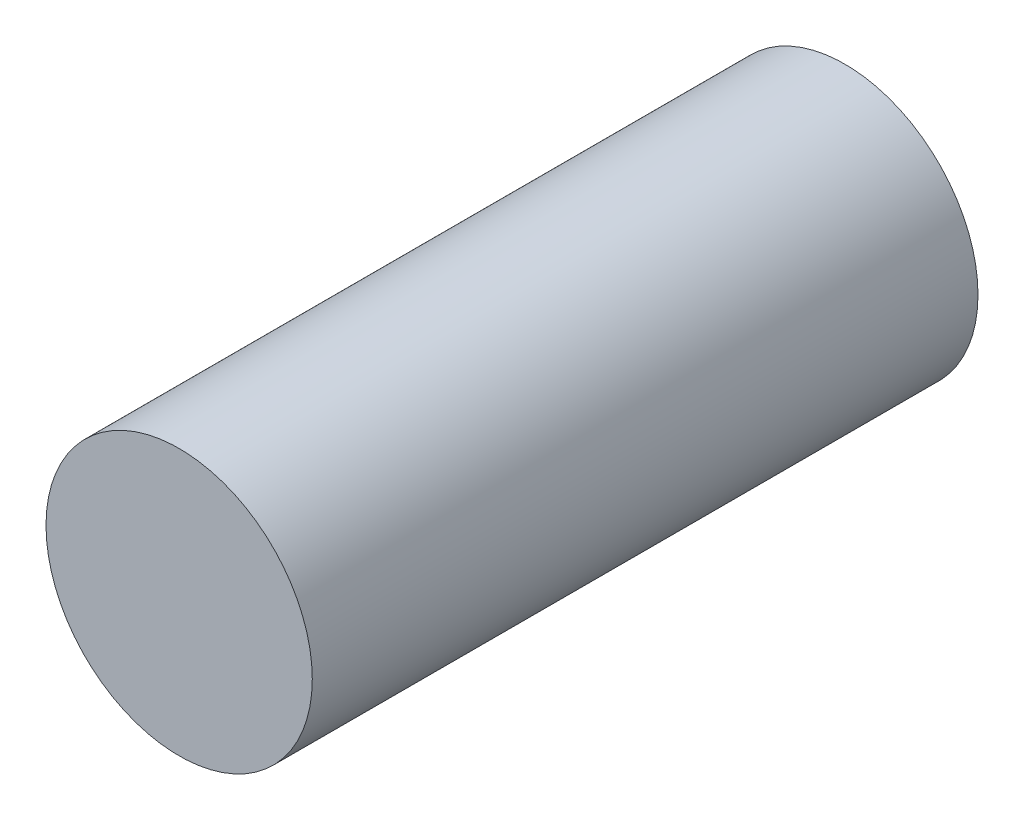
ISO-10303-21;
HEADER;
FILE_DESCRIPTION(('STEP AP214'),'2;1');
FILE_NAME('part.step','',(''),(''),'','','');
FILE_SCHEMA(('AUTOMOTIVE_DESIGN { 1 0 10303 214 1 1 1 1 }'));
ENDSEC;
DATA;
#1=APPLICATION_CONTEXT('core data for automotive mechanical design processes');
#2=APPLICATION_PROTOCOL_DEFINITION('international standard','automotive_design',2000,#1);
#3=PRODUCT_CONTEXT('',#1,'mechanical');
#4=PRODUCT('Part','Part','',(#3));
#5=PRODUCT_RELATED_PRODUCT_CATEGORY('part','',(#4));
#6=PRODUCT_DEFINITION_FORMATION('','',#4);
#7=PRODUCT_DEFINITION_CONTEXT('part definition',#1,'design');
#8=PRODUCT_DEFINITION('design','',#6,#7);
#9=PRODUCT_DEFINITION_SHAPE('','',#8);
#10=(LENGTH_UNIT() NAMED_UNIT(*) SI_UNIT(.MILLI.,.METRE.));
#11=(NAMED_UNIT(*) PLANE_ANGLE_UNIT() SI_UNIT($,.RADIAN.));
#12=(NAMED_UNIT(*) SI_UNIT($,.STERADIAN.) SOLID_ANGLE_UNIT());
#13=UNCERTAINTY_MEASURE_WITH_UNIT(LENGTH_MEASURE(1.E-05),#10,'distance_accuracy_value','');
#14=(GEOMETRIC_REPRESENTATION_CONTEXT(3) GLOBAL_UNCERTAINTY_ASSIGNED_CONTEXT((#13)) GLOBAL_UNIT_ASSIGNED_CONTEXT((#10,
#11,#12)) REPRESENTATION_CONTEXT('',''));
#15=CARTESIAN_POINT('',(0.,0.,0.));
#16=DIRECTION('',(0.,0.,1.));
#17=DIRECTION('',(1.,0.,0.));
#18=AXIS2_PLACEMENT_3D('',#15,#16,#17);
#19=CARTESIAN_POINT('',(0.,0.,15.875));
#20=DIRECTION('',(0.,0.,-1.));
#21=DIRECTION('',(-1.,0.,0.));
#22=AXIS2_PLACEMENT_3D('',#19,#20,#21);
#23=CYLINDRICAL_SURFACE('',#22,3.175);
#24=CARTESIAN_POINT('',(0.,0.,15.875));
#25=DIRECTION('',(0.,0.,1.));
#26=DIRECTION('',(1.,0.,0.));
#27=AXIS2_PLACEMENT_3D('',#24,#25,#26);
#28=CIRCLE('',#27,3.175);
#29=CARTESIAN_POINT('',(3.175,0.,15.875));
#30=VERTEX_POINT('',#29);
#31=EDGE_CURVE('E10',#30,#30,#28,.T.);
#32=ORIENTED_EDGE('',*,*,#31,.F.);
#33=EDGE_LOOP('',(#32));
#34=FACE_BOUND('',#33,.T.);
#35=CARTESIAN_POINT('',(0.,0.,0.));
#36=DIRECTION('',(0.,0.,1.));
#37=DIRECTION('',(1.,0.,0.));
#38=AXIS2_PLACEMENT_3D('',#35,#36,#37);
#39=CIRCLE('',#38,3.175);
#40=CARTESIAN_POINT('',(3.175,0.,0.));
#41=VERTEX_POINT('',#40);
#42=EDGE_CURVE('E34',#41,#41,#39,.T.);
#43=ORIENTED_EDGE('',*,*,#42,.T.);
#44=EDGE_LOOP('',(#43));
#45=FACE_BOUND('',#44,.T.);
#46=ADVANCED_FACE('F31',(#34,#45),#23,.T.);
#47=CARTESIAN_POINT('',(0.,0.,15.875));
#48=DIRECTION('',(0.,0.,1.));
#49=DIRECTION('',(1.,0.,0.));
#50=AXIS2_PLACEMENT_3D('',#47,#48,#49);
#51=PLANE('',#50);
#52=ORIENTED_EDGE('',*,*,#31,.T.);
#53=EDGE_LOOP('',(#52));
#54=FACE_BOUND('',#53,.T.);
#55=ADVANCED_FACE('F46',(#54),#51,.T.);
#56=CARTESIAN_POINT('',(0.,0.,0.));
#57=DIRECTION('',(0.,0.,1.));
#58=DIRECTION('',(1.,0.,0.));
#59=AXIS2_PLACEMENT_3D('',#56,#57,#58);
#60=PLANE('',#59);
#61=ORIENTED_EDGE('',*,*,#42,.F.);
#62=EDGE_LOOP('',(#61));
#63=FACE_BOUND('',#62,.T.);
#64=ADVANCED_FACE('F44',(#63),#60,.F.);
#65=CLOSED_SHELL('',(#46,#55,#64));
#66=MANIFOLD_SOLID_BREP('B2',#65);
#67=ADVANCED_BREP_SHAPE_REPRESENTATION('',(#18,#66),#14);
#68=SHAPE_DEFINITION_REPRESENTATION(#9,#67);
ENDSEC;
END-ISO-10303-21;
